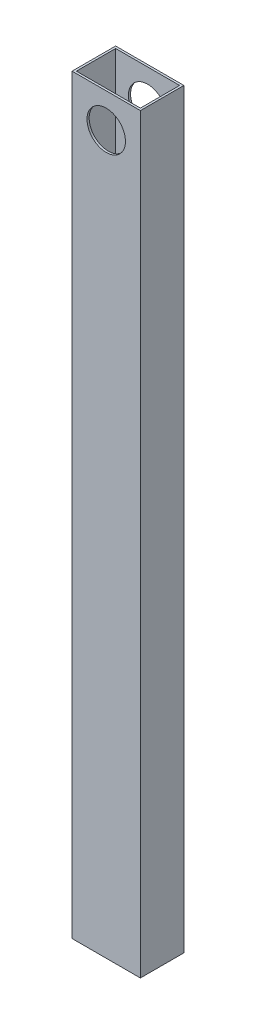
ISO-10303-21;
HEADER;
FILE_DESCRIPTION(('STEP AP214'),'2;1');
FILE_NAME('part.step','',(''),(''),'','','');
FILE_SCHEMA(('AUTOMOTIVE_DESIGN { 1 0 10303 214 1 1 1 1 }'));
ENDSEC;
DATA;
#1=APPLICATION_CONTEXT('core data for automotive mechanical design processes');
#2=APPLICATION_PROTOCOL_DEFINITION('international standard','automotive_design',2000,#1);
#3=PRODUCT_CONTEXT('',#1,'mechanical');
#4=PRODUCT('Part','Part','',(#3));
#5=PRODUCT_RELATED_PRODUCT_CATEGORY('part','',(#4));
#6=PRODUCT_DEFINITION_FORMATION('','',#4);
#7=PRODUCT_DEFINITION_CONTEXT('part definition',#1,'design');
#8=PRODUCT_DEFINITION('design','',#6,#7);
#9=PRODUCT_DEFINITION_SHAPE('','',#8);
#10=(LENGTH_UNIT() NAMED_UNIT(*) SI_UNIT(.MILLI.,.METRE.));
#11=(NAMED_UNIT(*) PLANE_ANGLE_UNIT() SI_UNIT($,.RADIAN.));
#12=(NAMED_UNIT(*) SI_UNIT($,.STERADIAN.) SOLID_ANGLE_UNIT());
#13=UNCERTAINTY_MEASURE_WITH_UNIT(LENGTH_MEASURE(1.E-05),#10,'distance_accuracy_value','');
#14=(GEOMETRIC_REPRESENTATION_CONTEXT(3) GLOBAL_UNCERTAINTY_ASSIGNED_CONTEXT((#13)) GLOBAL_UNIT_ASSIGNED_CONTEXT((#10,
#11,#12)) REPRESENTATION_CONTEXT('',''));
#15=CARTESIAN_POINT('',(0.,0.,0.));
#16=DIRECTION('',(0.,0.,1.));
#17=DIRECTION('',(1.,0.,0.));
#18=AXIS2_PLACEMENT_3D('',#15,#16,#17);
#19=CARTESIAN_POINT('',(88.8999999999999,652.526,-32.385));
#20=DIRECTION('',(0.,1.,0.));
#21=DIRECTION('',(0.,0.,1.));
#22=AXIS2_PLACEMENT_3D('',#19,#20,#21);
#23=PLANE('',#22);
#24=DIRECTION('',(-1.,0.,0.));
#25=VECTOR('',#24,1.);
#26=CARTESIAN_POINT('',(88.8999999999999,652.526,0.));
#27=LINE('',#26,#25);
#28=CARTESIAN_POINT('',(139.7,652.526,0.));
#29=VERTEX_POINT('',#28);
#30=CARTESIAN_POINT('',(88.8999999999999,652.526,0.));
#31=VERTEX_POINT('',#30);
#32=EDGE_CURVE('E164',#29,#31,#27,.T.);
#33=ORIENTED_EDGE('',*,*,#32,.F.);
#34=DIRECTION('',(0.,0.,1.));
#35=VECTOR('',#34,1.);
#36=CARTESIAN_POINT('',(139.7,652.526,-32.385));
#37=LINE('',#36,#35);
#38=CARTESIAN_POINT('',(139.7,652.526,-32.385));
#39=VERTEX_POINT('',#38);
#40=EDGE_CURVE('E55',#39,#29,#37,.T.);
#41=ORIENTED_EDGE('',*,*,#40,.F.);
#42=DIRECTION('',(-1.,0.,0.));
#43=VECTOR('',#42,1.);
#44=CARTESIAN_POINT('',(88.8999999999999,652.526,-32.385));
#45=LINE('',#44,#43);
#46=CARTESIAN_POINT('',(88.8999999999999,652.526,-32.385));
#47=VERTEX_POINT('',#46);
#48=EDGE_CURVE('E172',#39,#47,#45,.T.);
#49=ORIENTED_EDGE('',*,*,#48,.T.);
#50=DIRECTION('',(0.,0.,1.));
#51=VECTOR('',#50,1.);
#52=CARTESIAN_POINT('',(88.8999999999999,652.526,-32.385));
#53=LINE('',#52,#51);
#54=EDGE_CURVE('E11',#47,#31,#53,.T.);
#55=ORIENTED_EDGE('',*,*,#54,.T.);
#56=EDGE_LOOP('',(#33,#41,#49,#55));
#57=FACE_BOUND('',#56,.T.);
#58=DIRECTION('',(0.,0.,1.));
#59=VECTOR('',#58,1.);
#60=CARTESIAN_POINT('',(138.1125,652.526,-32.385));
#61=LINE('',#60,#59);
#62=CARTESIAN_POINT('',(138.1125,652.526,-30.7975));
#63=VERTEX_POINT('',#62);
#64=CARTESIAN_POINT('',(138.1125,652.526,-1.5875));
#65=VERTEX_POINT('',#64);
#66=EDGE_CURVE('E123',#63,#65,#61,.T.);
#67=ORIENTED_EDGE('',*,*,#66,.T.);
#68=DIRECTION('',(-1.,0.,0.));
#69=VECTOR('',#68,1.);
#70=CARTESIAN_POINT('',(0.,652.526,-1.5875));
#71=LINE('',#70,#69);
#72=CARTESIAN_POINT('',(90.4874999999999,652.526,-1.5875));
#73=VERTEX_POINT('',#72);
#74=EDGE_CURVE('E129',#65,#73,#71,.T.);
#75=ORIENTED_EDGE('',*,*,#74,.T.);
#76=DIRECTION('',(0.,0.,1.));
#77=VECTOR('',#76,1.);
#78=CARTESIAN_POINT('',(90.4874999999999,652.526,-32.385));
#79=LINE('',#78,#77);
#80=CARTESIAN_POINT('',(90.4874999999999,652.526,-30.7975));
#81=VERTEX_POINT('',#80);
#82=EDGE_CURVE('E113',#81,#73,#79,.T.);
#83=ORIENTED_EDGE('',*,*,#82,.F.);
#84=DIRECTION('',(-1.,0.,0.));
#85=VECTOR('',#84,1.);
#86=CARTESIAN_POINT('',(0.,652.526,-30.7975));
#87=LINE('',#86,#85);
#88=EDGE_CURVE('E63',#63,#81,#87,.T.);
#89=ORIENTED_EDGE('',*,*,#88,.F.);
#90=EDGE_LOOP('',(#67,#75,#83,#89));
#91=FACE_BOUND('',#90,.T.);
#92=ADVANCED_FACE('F45',(#57,#91),#23,.T.);
#93=CARTESIAN_POINT('',(88.8999999999999,93.726,-32.385));
#94=DIRECTION('',(0.,-1.,0.));
#95=DIRECTION('',(0.,0.,-1.));
#96=AXIS2_PLACEMENT_3D('',#93,#94,#95);
#97=PLANE('',#96);
#98=DIRECTION('',(1.,0.,0.));
#99=VECTOR('',#98,1.);
#100=CARTESIAN_POINT('',(88.8999999999999,93.726,0.));
#101=LINE('',#100,#99);
#102=CARTESIAN_POINT('',(88.8999999999999,93.726,0.));
#103=VERTEX_POINT('',#102);
#104=CARTESIAN_POINT('',(139.7,93.726,0.));
#105=VERTEX_POINT('',#104);
#106=EDGE_CURVE('E180',#103,#105,#101,.T.);
#107=ORIENTED_EDGE('',*,*,#106,.F.);
#108=DIRECTION('',(0.,0.,1.));
#109=VECTOR('',#108,1.);
#110=CARTESIAN_POINT('',(88.8999999999999,93.726,-32.385));
#111=LINE('',#110,#109);
#112=CARTESIAN_POINT('',(88.8999999999999,93.726,-32.385));
#113=VERTEX_POINT('',#112);
#114=EDGE_CURVE('E176',#113,#103,#111,.T.);
#115=ORIENTED_EDGE('',*,*,#114,.F.);
#116=DIRECTION('',(1.,0.,0.));
#117=VECTOR('',#116,1.);
#118=CARTESIAN_POINT('',(88.8999999999999,93.726,-32.385));
#119=LINE('',#118,#117);
#120=CARTESIAN_POINT('',(139.7,93.726,-32.385));
#121=VERTEX_POINT('',#120);
#122=EDGE_CURVE('E163',#113,#121,#119,.T.);
#123=ORIENTED_EDGE('',*,*,#122,.T.);
#124=DIRECTION('',(0.,0.,1.));
#125=VECTOR('',#124,1.);
#126=CARTESIAN_POINT('',(139.7,93.726,-32.385));
#127=LINE('',#126,#125);
#128=EDGE_CURVE('E193',#121,#105,#127,.T.);
#129=ORIENTED_EDGE('',*,*,#128,.T.);
#130=EDGE_LOOP('',(#107,#115,#123,#129));
#131=FACE_BOUND('',#130,.T.);
#132=DIRECTION('',(0.,0.,1.));
#133=VECTOR('',#132,1.);
#134=CARTESIAN_POINT('',(90.4874999999999,93.726,-32.385));
#135=LINE('',#134,#133);
#136=CARTESIAN_POINT('',(90.4874999999999,93.726,-30.7975));
#137=VERTEX_POINT('',#136);
#138=CARTESIAN_POINT('',(90.4874999999999,93.726,-1.5875));
#139=VERTEX_POINT('',#138);
#140=EDGE_CURVE('E149',#137,#139,#135,.T.);
#141=ORIENTED_EDGE('',*,*,#140,.T.);
#142=DIRECTION('',(1.,0.,0.));
#143=VECTOR('',#142,1.);
#144=CARTESIAN_POINT('',(0.,93.726,-1.5875));
#145=LINE('',#144,#143);
#146=CARTESIAN_POINT('',(138.1125,93.726,-1.5875));
#147=VERTEX_POINT('',#146);
#148=EDGE_CURVE('E132',#139,#147,#145,.T.);
#149=ORIENTED_EDGE('',*,*,#148,.T.);
#150=DIRECTION('',(0.,0.,1.));
#151=VECTOR('',#150,1.);
#152=CARTESIAN_POINT('',(138.1125,93.726,-32.385));
#153=LINE('',#152,#151);
#154=CARTESIAN_POINT('',(138.1125,93.726,-30.7975));
#155=VERTEX_POINT('',#154);
#156=EDGE_CURVE('E146',#155,#147,#153,.T.);
#157=ORIENTED_EDGE('',*,*,#156,.F.);
#158=DIRECTION('',(1.,0.,0.));
#159=VECTOR('',#158,1.);
#160=CARTESIAN_POINT('',(0.,93.726,-30.7975));
#161=LINE('',#160,#159);
#162=EDGE_CURVE('E68',#137,#155,#161,.T.);
#163=ORIENTED_EDGE('',*,*,#162,.F.);
#164=EDGE_LOOP('',(#141,#149,#157,#163));
#165=FACE_BOUND('',#164,.T.);
#166=ADVANCED_FACE('F202',(#131,#165),#97,.T.);
#167=CARTESIAN_POINT('',(88.8999999999999,652.526,-32.385));
#168=DIRECTION('',(-1.,0.,0.));
#169=DIRECTION('',(0.,0.,1.));
#170=AXIS2_PLACEMENT_3D('',#167,#168,#169);
#171=PLANE('',#170);
#172=DIRECTION('',(0.,-1.,0.));
#173=VECTOR('',#172,1.);
#174=CARTESIAN_POINT('',(88.8999999999999,652.526,0.));
#175=LINE('',#174,#173);
#176=EDGE_CURVE('E122',#31,#103,#175,.T.);
#177=ORIENTED_EDGE('',*,*,#176,.F.);
#178=ORIENTED_EDGE('',*,*,#54,.F.);
#179=DIRECTION('',(0.,-1.,0.));
#180=VECTOR('',#179,1.);
#181=CARTESIAN_POINT('',(88.8999999999999,652.526,-32.385));
#182=LINE('',#181,#180);
#183=EDGE_CURVE('E159',#47,#113,#182,.T.);
#184=ORIENTED_EDGE('',*,*,#183,.T.);
#185=ORIENTED_EDGE('',*,*,#114,.T.);
#186=EDGE_LOOP('',(#177,#178,#184,#185));
#187=FACE_BOUND('',#186,.T.);
#188=ADVANCED_FACE('F47',(#187),#171,.T.);
#189=CARTESIAN_POINT('',(139.7,652.526,-32.385));
#190=DIRECTION('',(1.,0.,0.));
#191=DIRECTION('',(0.,0.,-1.));
#192=AXIS2_PLACEMENT_3D('',#189,#190,#191);
#193=PLANE('',#192);
#194=DIRECTION('',(0.,1.,0.));
#195=VECTOR('',#194,1.);
#196=CARTESIAN_POINT('',(139.7,652.526,0.));
#197=LINE('',#196,#195);
#198=EDGE_CURVE('E184',#105,#29,#197,.T.);
#199=ORIENTED_EDGE('',*,*,#198,.F.);
#200=ORIENTED_EDGE('',*,*,#128,.F.);
#201=DIRECTION('',(0.,1.,0.));
#202=VECTOR('',#201,1.);
#203=CARTESIAN_POINT('',(139.7,652.526,-32.385));
#204=LINE('',#203,#202);
#205=EDGE_CURVE('E168',#121,#39,#204,.T.);
#206=ORIENTED_EDGE('',*,*,#205,.T.);
#207=ORIENTED_EDGE('',*,*,#40,.T.);
#208=EDGE_LOOP('',(#199,#200,#206,#207));
#209=FACE_BOUND('',#208,.T.);
#210=ADVANCED_FACE('F214',(#209),#193,.T.);
#211=CARTESIAN_POINT('',(0.,0.,-32.385));
#212=DIRECTION('',(0.,0.,1.));
#213=DIRECTION('',(1.,0.,0.));
#214=AXIS2_PLACEMENT_3D('',#211,#212,#213);
#215=PLANE('',#214);
#216=CARTESIAN_POINT('',(114.3,627.126,-32.385));
#217=DIRECTION('',(0.,0.,1.));
#218=DIRECTION('',(1.,0.,0.));
#219=AXIS2_PLACEMENT_3D('',#216,#217,#218);
#220=CIRCLE('',#219,14.2875);
#221=CARTESIAN_POINT('',(128.5875,627.126,-32.385));
#222=VERTEX_POINT('',#221);
#223=EDGE_CURVE('E259',#222,#222,#220,.T.);
#224=ORIENTED_EDGE('',*,*,#223,.T.);
#225=EDGE_LOOP('',(#224));
#226=FACE_BOUND('',#225,.T.);
#227=ORIENTED_EDGE('',*,*,#183,.F.);
#228=ORIENTED_EDGE('',*,*,#48,.F.);
#229=ORIENTED_EDGE('',*,*,#205,.F.);
#230=ORIENTED_EDGE('',*,*,#122,.F.);
#231=EDGE_LOOP('',(#227,#228,#229,#230));
#232=FACE_BOUND('',#231,.T.);
#233=ADVANCED_FACE('F211',(#226,#232),#215,.F.);
#234=CARTESIAN_POINT('',(0.,0.,0.));
#235=DIRECTION('',(0.,0.,1.));
#236=DIRECTION('',(1.,0.,0.));
#237=AXIS2_PLACEMENT_3D('',#234,#235,#236);
#238=PLANE('',#237);
#239=CARTESIAN_POINT('',(114.3,627.126,0.));
#240=DIRECTION('',(0.,0.,1.));
#241=DIRECTION('',(1.,0.,0.));
#242=AXIS2_PLACEMENT_3D('',#239,#240,#241);
#243=CIRCLE('',#242,14.2875);
#244=CARTESIAN_POINT('',(128.5875,627.126,0.));
#245=VERTEX_POINT('',#244);
#246=EDGE_CURVE('E134',#245,#245,#243,.T.);
#247=ORIENTED_EDGE('',*,*,#246,.F.);
#248=EDGE_LOOP('',(#247));
#249=FACE_BOUND('',#248,.T.);
#250=ORIENTED_EDGE('',*,*,#176,.T.);
#251=ORIENTED_EDGE('',*,*,#106,.T.);
#252=ORIENTED_EDGE('',*,*,#198,.T.);
#253=ORIENTED_EDGE('',*,*,#32,.T.);
#254=EDGE_LOOP('',(#250,#251,#252,#253));
#255=FACE_BOUND('',#254,.T.);
#256=ADVANCED_FACE('F206',(#249,#255),#238,.T.);
#257=CARTESIAN_POINT('',(90.4874999999999,652.526,-32.385));
#258=DIRECTION('',(-1.,0.,0.));
#259=DIRECTION('',(0.,0.,1.));
#260=AXIS2_PLACEMENT_3D('',#257,#258,#259);
#261=PLANE('',#260);
#262=DIRECTION('',(0.,-1.,0.));
#263=VECTOR('',#262,1.);
#264=CARTESIAN_POINT('',(90.4874999999999,0.,-1.5875));
#265=LINE('',#264,#263);
#266=EDGE_CURVE('E116',#73,#139,#265,.T.);
#267=ORIENTED_EDGE('',*,*,#266,.T.);
#268=ORIENTED_EDGE('',*,*,#140,.F.);
#269=DIRECTION('',(0.,-1.,0.));
#270=VECTOR('',#269,1.);
#271=CARTESIAN_POINT('',(90.4874999999999,0.,-30.7975));
#272=LINE('',#271,#270);
#273=EDGE_CURVE('E118',#81,#137,#272,.T.);
#274=ORIENTED_EDGE('',*,*,#273,.F.);
#275=ORIENTED_EDGE('',*,*,#82,.T.);
#276=EDGE_LOOP('',(#267,#268,#274,#275));
#277=FACE_BOUND('',#276,.T.);
#278=ADVANCED_FACE('F115',(#277),#261,.F.);
#279=CARTESIAN_POINT('',(138.1125,652.526,-32.385));
#280=DIRECTION('',(1.,0.,0.));
#281=DIRECTION('',(0.,0.,-1.));
#282=AXIS2_PLACEMENT_3D('',#279,#280,#281);
#283=PLANE('',#282);
#284=DIRECTION('',(0.,1.,0.));
#285=VECTOR('',#284,1.);
#286=CARTESIAN_POINT('',(138.1125,0.,-1.5875));
#287=LINE('',#286,#285);
#288=EDGE_CURVE('E137',#147,#65,#287,.T.);
#289=ORIENTED_EDGE('',*,*,#288,.T.);
#290=ORIENTED_EDGE('',*,*,#66,.F.);
#291=DIRECTION('',(0.,1.,0.));
#292=VECTOR('',#291,1.);
#293=CARTESIAN_POINT('',(138.1125,0.,-30.7975));
#294=LINE('',#293,#292);
#295=EDGE_CURVE('E150',#155,#63,#294,.T.);
#296=ORIENTED_EDGE('',*,*,#295,.F.);
#297=ORIENTED_EDGE('',*,*,#156,.T.);
#298=EDGE_LOOP('',(#289,#290,#296,#297));
#299=FACE_BOUND('',#298,.T.);
#300=ADVANCED_FACE('F239',(#299),#283,.F.);
#301=CARTESIAN_POINT('',(0.,0.,-30.7975));
#302=DIRECTION('',(0.,0.,1.));
#303=DIRECTION('',(1.,0.,0.));
#304=AXIS2_PLACEMENT_3D('',#301,#302,#303);
#305=PLANE('',#304);
#306=CARTESIAN_POINT('',(114.3,627.126,-30.7975));
#307=DIRECTION('',(0.,0.,1.));
#308=DIRECTION('',(1.,0.,0.));
#309=AXIS2_PLACEMENT_3D('',#306,#307,#308);
#310=CIRCLE('',#309,14.2875);
#311=CARTESIAN_POINT('',(128.5875,627.126,-30.7975));
#312=VERTEX_POINT('',#311);
#313=EDGE_CURVE('E256',#312,#312,#310,.T.);
#314=ORIENTED_EDGE('',*,*,#313,.F.);
#315=EDGE_LOOP('',(#314));
#316=FACE_BOUND('',#315,.T.);
#317=ORIENTED_EDGE('',*,*,#273,.T.);
#318=ORIENTED_EDGE('',*,*,#162,.T.);
#319=ORIENTED_EDGE('',*,*,#295,.T.);
#320=ORIENTED_EDGE('',*,*,#88,.T.);
#321=EDGE_LOOP('',(#317,#318,#319,#320));
#322=FACE_BOUND('',#321,.T.);
#323=ADVANCED_FACE('F235',(#316,#322),#305,.T.);
#324=CARTESIAN_POINT('',(0.,0.,-1.5875));
#325=DIRECTION('',(0.,0.,1.));
#326=DIRECTION('',(1.,0.,0.));
#327=AXIS2_PLACEMENT_3D('',#324,#325,#326);
#328=PLANE('',#327);
#329=CARTESIAN_POINT('',(114.3,627.126,-1.5875));
#330=DIRECTION('',(0.,0.,1.));
#331=DIRECTION('',(1.,0.,0.));
#332=AXIS2_PLACEMENT_3D('',#329,#330,#331);
#333=CIRCLE('',#332,14.2875);
#334=CARTESIAN_POINT('',(128.5875,627.126,-1.5875));
#335=VERTEX_POINT('',#334);
#336=EDGE_CURVE('E49',#335,#335,#333,.T.);
#337=ORIENTED_EDGE('',*,*,#336,.T.);
#338=EDGE_LOOP('',(#337));
#339=FACE_BOUND('',#338,.T.);
#340=ORIENTED_EDGE('',*,*,#266,.F.);
#341=ORIENTED_EDGE('',*,*,#74,.F.);
#342=ORIENTED_EDGE('',*,*,#288,.F.);
#343=ORIENTED_EDGE('',*,*,#148,.F.);
#344=EDGE_LOOP('',(#340,#341,#342,#343));
#345=FACE_BOUND('',#344,.T.);
#346=ADVANCED_FACE('F127',(#339,#345),#328,.F.);
#347=CARTESIAN_POINT('',(114.3,627.126,-32.385));
#348=DIRECTION('',(0.,0.,1.));
#349=DIRECTION('',(1.,0.,0.));
#350=AXIS2_PLACEMENT_3D('',#347,#348,#349);
#351=CYLINDRICAL_SURFACE('',#350,14.2875);
#352=ORIENTED_EDGE('',*,*,#246,.T.);
#353=EDGE_LOOP('',(#352));
#354=FACE_BOUND('',#353,.T.);
#355=ORIENTED_EDGE('',*,*,#336,.F.);
#356=EDGE_LOOP('',(#355));
#357=FACE_BOUND('',#356,.T.);
#358=ADVANCED_FACE('F234',(#354,#357),#351,.F.);
#359=ORIENTED_EDGE('',*,*,#313,.T.);
#360=EDGE_LOOP('',(#359));
#361=FACE_BOUND('',#360,.T.);
#362=ORIENTED_EDGE('',*,*,#223,.F.);
#363=EDGE_LOOP('',(#362));
#364=FACE_BOUND('',#363,.T.);
#365=ADVANCED_FACE('F246',(#361,#364),#351,.F.);
#366=CLOSED_SHELL('',(#92,#166,#188,#210,#233,#256,#278,#300,#323,#346,#358,#365));
#367=MANIFOLD_SOLID_BREP('B2',#366);
#368=ADVANCED_BREP_SHAPE_REPRESENTATION('',(#18,#367),#14);
#369=SHAPE_DEFINITION_REPRESENTATION(#9,#368);
ENDSEC;
END-ISO-10303-21;
